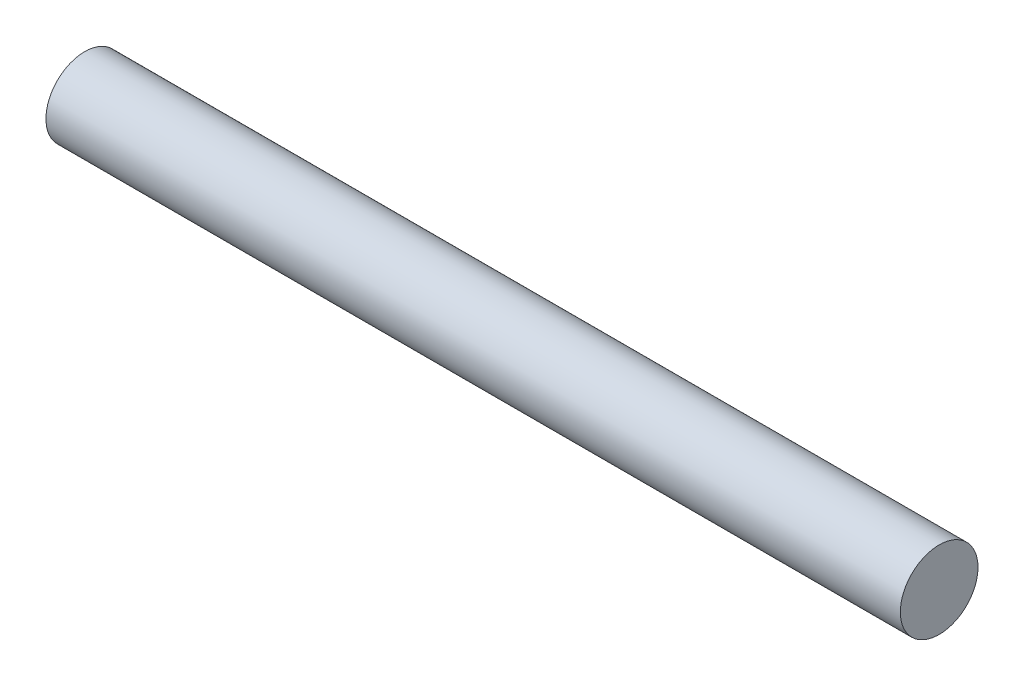
ISO-10303-21;
HEADER;
FILE_DESCRIPTION(('STEP AP214'),'2;1');
FILE_NAME('part.step','',(''),(''),'','','');
FILE_SCHEMA(('AUTOMOTIVE_DESIGN { 1 0 10303 214 1 1 1 1 }'));
ENDSEC;
DATA;
#1=APPLICATION_CONTEXT('core data for automotive mechanical design processes');
#2=APPLICATION_PROTOCOL_DEFINITION('international standard','automotive_design',2000,#1);
#3=PRODUCT_CONTEXT('',#1,'mechanical');
#4=PRODUCT('Part','Part','',(#3));
#5=PRODUCT_RELATED_PRODUCT_CATEGORY('part','',(#4));
#6=PRODUCT_DEFINITION_FORMATION('','',#4);
#7=PRODUCT_DEFINITION_CONTEXT('part definition',#1,'design');
#8=PRODUCT_DEFINITION('design','',#6,#7);
#9=PRODUCT_DEFINITION_SHAPE('','',#8);
#10=(LENGTH_UNIT() NAMED_UNIT(*) SI_UNIT(.MILLI.,.METRE.));
#11=(NAMED_UNIT(*) PLANE_ANGLE_UNIT() SI_UNIT($,.RADIAN.));
#12=(NAMED_UNIT(*) SI_UNIT($,.STERADIAN.) SOLID_ANGLE_UNIT());
#13=UNCERTAINTY_MEASURE_WITH_UNIT(LENGTH_MEASURE(1.E-05),#10,'distance_accuracy_value','');
#14=(GEOMETRIC_REPRESENTATION_CONTEXT(3) GLOBAL_UNCERTAINTY_ASSIGNED_CONTEXT((#13)) GLOBAL_UNIT_ASSIGNED_CONTEXT((#10,
#11,#12)) REPRESENTATION_CONTEXT('',''));
#15=CARTESIAN_POINT('',(0.,0.,0.));
#16=DIRECTION('',(0.,0.,1.));
#17=DIRECTION('',(1.,0.,0.));
#18=AXIS2_PLACEMENT_3D('',#15,#16,#17);
#19=CARTESIAN_POINT('',(22.,0.,0.));
#20=DIRECTION('',(-1.,0.,0.));
#21=DIRECTION('',(0.,0.,1.));
#22=AXIS2_PLACEMENT_3D('',#19,#20,#21);
#23=CYLINDRICAL_SURFACE('',#22,1.);
#24=CARTESIAN_POINT('',(22.,0.,0.));
#25=DIRECTION('',(1.,0.,0.));
#26=DIRECTION('',(0.,0.,-1.));
#27=AXIS2_PLACEMENT_3D('',#24,#25,#26);
#28=CIRCLE('',#27,1.);
#29=CARTESIAN_POINT('',(22.,0.,-1.));
#30=VERTEX_POINT('',#29);
#31=EDGE_CURVE('E10',#30,#30,#28,.T.);
#32=ORIENTED_EDGE('',*,*,#31,.F.);
#33=EDGE_LOOP('',(#32));
#34=FACE_BOUND('',#33,.T.);
#35=CARTESIAN_POINT('',(0.,0.,0.));
#36=DIRECTION('',(1.,0.,0.));
#37=DIRECTION('',(0.,0.,-1.));
#38=AXIS2_PLACEMENT_3D('',#35,#36,#37);
#39=CIRCLE('',#38,1.);
#40=CARTESIAN_POINT('',(0.,0.,-1.));
#41=VERTEX_POINT('',#40);
#42=EDGE_CURVE('E34',#41,#41,#39,.T.);
#43=ORIENTED_EDGE('',*,*,#42,.T.);
#44=EDGE_LOOP('',(#43));
#45=FACE_BOUND('',#44,.T.);
#46=ADVANCED_FACE('F31',(#34,#45),#23,.T.);
#47=CARTESIAN_POINT('',(22.,0.,0.));
#48=DIRECTION('',(1.,0.,0.));
#49=DIRECTION('',(0.,0.,-1.));
#50=AXIS2_PLACEMENT_3D('',#47,#48,#49);
#51=PLANE('',#50);
#52=ORIENTED_EDGE('',*,*,#31,.T.);
#53=EDGE_LOOP('',(#52));
#54=FACE_BOUND('',#53,.T.);
#55=ADVANCED_FACE('F46',(#54),#51,.T.);
#56=CARTESIAN_POINT('',(0.,0.,0.));
#57=DIRECTION('',(1.,0.,0.));
#58=DIRECTION('',(0.,0.,-1.));
#59=AXIS2_PLACEMENT_3D('',#56,#57,#58);
#60=PLANE('',#59);
#61=ORIENTED_EDGE('',*,*,#42,.F.);
#62=EDGE_LOOP('',(#61));
#63=FACE_BOUND('',#62,.T.);
#64=ADVANCED_FACE('F44',(#63),#60,.F.);
#65=CLOSED_SHELL('',(#46,#55,#64));
#66=MANIFOLD_SOLID_BREP('B2',#65);
#67=ADVANCED_BREP_SHAPE_REPRESENTATION('',(#18,#66),#14);
#68=SHAPE_DEFINITION_REPRESENTATION(#9,#67);
ENDSEC;
END-ISO-10303-21;
